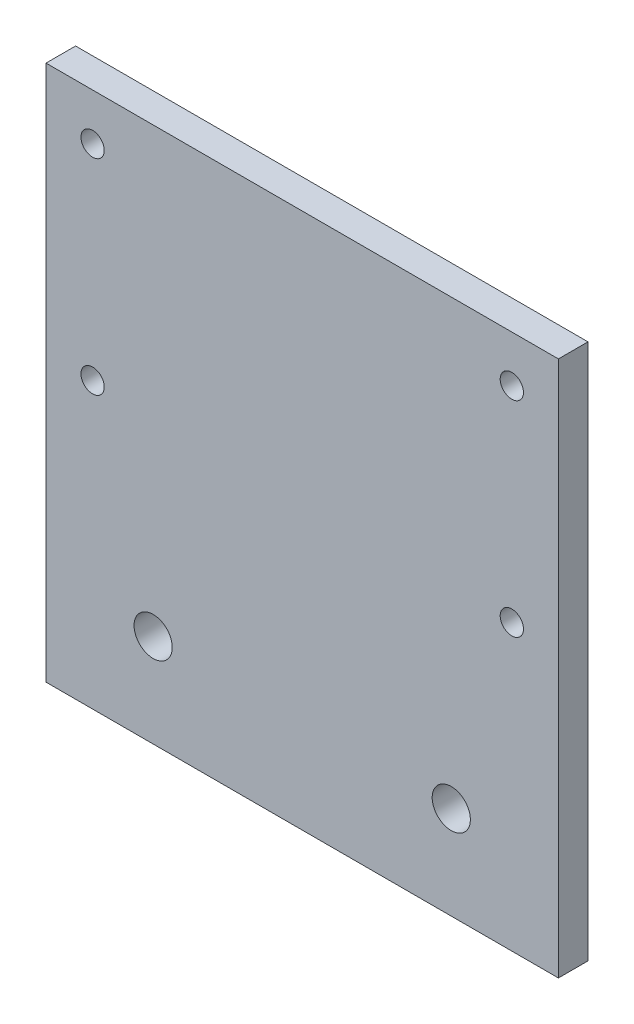
ISO-10303-21;
HEADER;
FILE_DESCRIPTION(('STEP AP214'),'2;1');
FILE_NAME('part.step','',(''),(''),'','','');
FILE_SCHEMA(('AUTOMOTIVE_DESIGN { 1 0 10303 214 1 1 1 1 }'));
ENDSEC;
DATA;
#1=APPLICATION_CONTEXT('core data for automotive mechanical design processes');
#2=APPLICATION_PROTOCOL_DEFINITION('international standard','automotive_design',2000,#1);
#3=PRODUCT_CONTEXT('',#1,'mechanical');
#4=PRODUCT('Part','Part','',(#3));
#5=PRODUCT_RELATED_PRODUCT_CATEGORY('part','',(#4));
#6=PRODUCT_DEFINITION_FORMATION('','',#4);
#7=PRODUCT_DEFINITION_CONTEXT('part definition',#1,'design');
#8=PRODUCT_DEFINITION('design','',#6,#7);
#9=PRODUCT_DEFINITION_SHAPE('','',#8);
#10=(LENGTH_UNIT() NAMED_UNIT(*) SI_UNIT(.MILLI.,.METRE.));
#11=(NAMED_UNIT(*) PLANE_ANGLE_UNIT() SI_UNIT($,.RADIAN.));
#12=(NAMED_UNIT(*) SI_UNIT($,.STERADIAN.) SOLID_ANGLE_UNIT());
#13=UNCERTAINTY_MEASURE_WITH_UNIT(LENGTH_MEASURE(1.E-05),#10,'distance_accuracy_value','');
#14=(GEOMETRIC_REPRESENTATION_CONTEXT(3) GLOBAL_UNCERTAINTY_ASSIGNED_CONTEXT((#13)) GLOBAL_UNIT_ASSIGNED_CONTEXT((#10,
#11,#12)) REPRESENTATION_CONTEXT('',''));
#15=CARTESIAN_POINT('',(0.,0.,0.));
#16=DIRECTION('',(0.,0.,1.));
#17=DIRECTION('',(1.,0.,0.));
#18=AXIS2_PLACEMENT_3D('',#15,#16,#17);
#19=CARTESIAN_POINT('',(0.,0.,3.175));
#20=DIRECTION('',(0.,0.,-1.));
#21=DIRECTION('',(-1.,0.,0.));
#22=AXIS2_PLACEMENT_3D('',#19,#20,#21);
#23=PLANE('',#22);
#24=DIRECTION('',(0.,-1.,0.));
#25=VECTOR('',#24,1.);
#26=CARTESIAN_POINT('',(0.,0.,3.175));
#27=LINE('',#26,#25);
#28=CARTESIAN_POINT('',(0.,57.55,3.175));
#29=VERTEX_POINT('',#28);
#30=CARTESIAN_POINT('',(0.,0.,3.175));
#31=VERTEX_POINT('',#30);
#32=EDGE_CURVE('E92',#29,#31,#27,.T.);
#33=ORIENTED_EDGE('',*,*,#32,.T.);
#34=DIRECTION('',(1.,0.,0.));
#35=VECTOR('',#34,1.);
#36=CARTESIAN_POINT('',(0.,0.,3.175));
#37=LINE('',#36,#35);
#38=CARTESIAN_POINT('',(55.,0.,3.175));
#39=VERTEX_POINT('',#38);
#40=EDGE_CURVE('E87',#31,#39,#37,.T.);
#41=ORIENTED_EDGE('',*,*,#40,.T.);
#42=DIRECTION('',(0.,1.,0.));
#43=VECTOR('',#42,1.);
#44=CARTESIAN_POINT('',(55.,0.,3.175));
#45=LINE('',#44,#43);
#46=CARTESIAN_POINT('',(55.,57.55,3.175));
#47=VERTEX_POINT('',#46);
#48=EDGE_CURVE('E90',#39,#47,#45,.T.);
#49=ORIENTED_EDGE('',*,*,#48,.T.);
#50=DIRECTION('',(-1.,0.,0.));
#51=VECTOR('',#50,1.);
#52=CARTESIAN_POINT('',(0.,57.55,3.175));
#53=LINE('',#52,#51);
#54=EDGE_CURVE('E57',#47,#29,#53,.T.);
#55=ORIENTED_EDGE('',*,*,#54,.T.);
#56=EDGE_LOOP('',(#33,#41,#49,#55));
#57=FACE_BOUND('',#56,.T.);
#58=CARTESIAN_POINT('',(4.99999999999999,52.55,3.175));
#59=DIRECTION('',(0.,0.,1.));
#60=DIRECTION('',(1.,0.,0.));
#61=AXIS2_PLACEMENT_3D('',#58,#59,#60);
#62=CIRCLE('',#61,1.25);
#63=CARTESIAN_POINT('',(6.24999999999999,52.55,3.175));
#64=VERTEX_POINT('',#63);
#65=EDGE_CURVE('E112',#64,#64,#62,.T.);
#66=ORIENTED_EDGE('',*,*,#65,.F.);
#67=EDGE_LOOP('',(#66));
#68=FACE_BOUND('',#67,.T.);
#69=CARTESIAN_POINT('',(11.5,9.99999999999999,3.175));
#70=DIRECTION('',(0.,0.,1.));
#71=DIRECTION('',(1.,0.,0.));
#72=AXIS2_PLACEMENT_3D('',#69,#70,#71);
#73=CIRCLE('',#72,2.05);
#74=CARTESIAN_POINT('',(13.55,9.99999999999999,3.175));
#75=VERTEX_POINT('',#74);
#76=EDGE_CURVE('E134',#75,#75,#73,.T.);
#77=ORIENTED_EDGE('',*,*,#76,.F.);
#78=EDGE_LOOP('',(#77));
#79=FACE_BOUND('',#78,.T.);
#80=CARTESIAN_POINT('',(50.,52.55,3.175));
#81=DIRECTION('',(0.,0.,1.));
#82=DIRECTION('',(1.,0.,0.));
#83=AXIS2_PLACEMENT_3D('',#80,#81,#82);
#84=CIRCLE('',#83,1.25);
#85=CARTESIAN_POINT('',(51.25,52.55,3.175));
#86=VERTEX_POINT('',#85);
#87=EDGE_CURVE('E142',#86,#86,#84,.T.);
#88=ORIENTED_EDGE('',*,*,#87,.F.);
#89=EDGE_LOOP('',(#88));
#90=FACE_BOUND('',#89,.T.);
#91=CARTESIAN_POINT('',(50.0000000000002,30.55,3.175));
#92=DIRECTION('',(0.,0.,1.));
#93=DIRECTION('',(1.,0.,0.));
#94=AXIS2_PLACEMENT_3D('',#91,#92,#93);
#95=CIRCLE('',#94,1.25);
#96=CARTESIAN_POINT('',(51.2500000000002,30.55,3.175));
#97=VERTEX_POINT('',#96);
#98=EDGE_CURVE('E150',#97,#97,#95,.T.);
#99=ORIENTED_EDGE('',*,*,#98,.F.);
#100=EDGE_LOOP('',(#99));
#101=FACE_BOUND('',#100,.T.);
#102=CARTESIAN_POINT('',(5.00000000000022,30.55,3.175));
#103=DIRECTION('',(0.,0.,1.));
#104=DIRECTION('',(1.,0.,0.));
#105=AXIS2_PLACEMENT_3D('',#102,#103,#104);
#106=CIRCLE('',#105,1.25);
#107=CARTESIAN_POINT('',(6.25000000000022,30.55,3.175));
#108=VERTEX_POINT('',#107);
#109=EDGE_CURVE('E158',#108,#108,#106,.T.);
#110=ORIENTED_EDGE('',*,*,#109,.F.);
#111=EDGE_LOOP('',(#110));
#112=FACE_BOUND('',#111,.T.);
#113=CARTESIAN_POINT('',(43.5,10.,3.175));
#114=DIRECTION('',(0.,0.,1.));
#115=DIRECTION('',(1.,0.,0.));
#116=AXIS2_PLACEMENT_3D('',#113,#114,#115);
#117=CIRCLE('',#116,2.05);
#118=CARTESIAN_POINT('',(45.55,10.,3.175));
#119=VERTEX_POINT('',#118);
#120=EDGE_CURVE('E166',#119,#119,#117,.T.);
#121=ORIENTED_EDGE('',*,*,#120,.F.);
#122=EDGE_LOOP('',(#121));
#123=FACE_BOUND('',#122,.T.);
#124=ADVANCED_FACE('F39',(#57,#68,#79,#90,#101,#112,#123),#23,.F.);
#125=CARTESIAN_POINT('',(0.,0.,0.));
#126=DIRECTION('',(0.,0.,-1.));
#127=DIRECTION('',(-1.,0.,0.));
#128=AXIS2_PLACEMENT_3D('',#125,#126,#127);
#129=PLANE('',#128);
#130=CARTESIAN_POINT('',(5.00000000000022,30.55,0.));
#131=DIRECTION('',(0.,0.,1.));
#132=DIRECTION('',(1.,0.,0.));
#133=AXIS2_PLACEMENT_3D('',#130,#131,#132);
#134=CIRCLE('',#133,1.25);
#135=CARTESIAN_POINT('',(6.25000000000022,30.55,0.));
#136=VERTEX_POINT('',#135);
#137=EDGE_CURVE('E162',#136,#136,#134,.T.);
#138=ORIENTED_EDGE('',*,*,#137,.T.);
#139=EDGE_LOOP('',(#138));
#140=FACE_BOUND('',#139,.T.);
#141=CARTESIAN_POINT('',(50.,52.55,0.));
#142=DIRECTION('',(0.,0.,1.));
#143=DIRECTION('',(1.,0.,0.));
#144=AXIS2_PLACEMENT_3D('',#141,#142,#143);
#145=CIRCLE('',#144,1.25);
#146=CARTESIAN_POINT('',(51.25,52.55,0.));
#147=VERTEX_POINT('',#146);
#148=EDGE_CURVE('E146',#147,#147,#145,.T.);
#149=ORIENTED_EDGE('',*,*,#148,.T.);
#150=EDGE_LOOP('',(#149));
#151=FACE_BOUND('',#150,.T.);
#152=CARTESIAN_POINT('',(4.99999999999999,52.55,0.));
#153=DIRECTION('',(0.,0.,1.));
#154=DIRECTION('',(1.,0.,0.));
#155=AXIS2_PLACEMENT_3D('',#152,#153,#154);
#156=CIRCLE('',#155,1.25);
#157=CARTESIAN_POINT('',(6.24999999999999,52.55,0.));
#158=VERTEX_POINT('',#157);
#159=EDGE_CURVE('E130',#158,#158,#156,.T.);
#160=ORIENTED_EDGE('',*,*,#159,.T.);
#161=EDGE_LOOP('',(#160));
#162=FACE_BOUND('',#161,.T.);
#163=DIRECTION('',(0.,-1.,0.));
#164=VECTOR('',#163,1.);
#165=CARTESIAN_POINT('',(0.,0.,0.));
#166=LINE('',#165,#164);
#167=CARTESIAN_POINT('',(0.,57.55,0.));
#168=VERTEX_POINT('',#167);
#169=CARTESIAN_POINT('',(0.,0.,0.));
#170=VERTEX_POINT('',#169);
#171=EDGE_CURVE('E108',#168,#170,#166,.T.);
#172=ORIENTED_EDGE('',*,*,#171,.F.);
#173=DIRECTION('',(-1.,0.,0.));
#174=VECTOR('',#173,1.);
#175=CARTESIAN_POINT('',(0.,57.55,0.));
#176=LINE('',#175,#174);
#177=CARTESIAN_POINT('',(55.,57.55,0.));
#178=VERTEX_POINT('',#177);
#179=EDGE_CURVE('E80',#178,#168,#176,.T.);
#180=ORIENTED_EDGE('',*,*,#179,.F.);
#181=DIRECTION('',(0.,1.,0.));
#182=VECTOR('',#181,1.);
#183=CARTESIAN_POINT('',(55.,0.,0.));
#184=LINE('',#183,#182);
#185=CARTESIAN_POINT('',(55.,0.,0.));
#186=VERTEX_POINT('',#185);
#187=EDGE_CURVE('E74',#186,#178,#184,.T.);
#188=ORIENTED_EDGE('',*,*,#187,.F.);
#189=DIRECTION('',(1.,0.,0.));
#190=VECTOR('',#189,1.);
#191=CARTESIAN_POINT('',(0.,0.,0.));
#192=LINE('',#191,#190);
#193=EDGE_CURVE('E97',#170,#186,#192,.T.);
#194=ORIENTED_EDGE('',*,*,#193,.F.);
#195=EDGE_LOOP('',(#172,#180,#188,#194));
#196=FACE_BOUND('',#195,.T.);
#197=CARTESIAN_POINT('',(11.5,9.99999999999999,0.));
#198=DIRECTION('',(0.,0.,1.));
#199=DIRECTION('',(1.,0.,0.));
#200=AXIS2_PLACEMENT_3D('',#197,#198,#199);
#201=CIRCLE('',#200,2.05);
#202=CARTESIAN_POINT('',(13.55,9.99999999999999,0.));
#203=VERTEX_POINT('',#202);
#204=EDGE_CURVE('E138',#203,#203,#201,.T.);
#205=ORIENTED_EDGE('',*,*,#204,.T.);
#206=EDGE_LOOP('',(#205));
#207=FACE_BOUND('',#206,.T.);
#208=CARTESIAN_POINT('',(50.0000000000002,30.55,0.));
#209=DIRECTION('',(0.,0.,1.));
#210=DIRECTION('',(1.,0.,0.));
#211=AXIS2_PLACEMENT_3D('',#208,#209,#210);
#212=CIRCLE('',#211,1.25);
#213=CARTESIAN_POINT('',(51.2500000000002,30.55,0.));
#214=VERTEX_POINT('',#213);
#215=EDGE_CURVE('E154',#214,#214,#212,.T.);
#216=ORIENTED_EDGE('',*,*,#215,.T.);
#217=EDGE_LOOP('',(#216));
#218=FACE_BOUND('',#217,.T.);
#219=CARTESIAN_POINT('',(43.5,10.,0.));
#220=DIRECTION('',(0.,0.,1.));
#221=DIRECTION('',(1.,0.,0.));
#222=AXIS2_PLACEMENT_3D('',#219,#220,#221);
#223=CIRCLE('',#222,2.05);
#224=CARTESIAN_POINT('',(45.55,10.,0.));
#225=VERTEX_POINT('',#224);
#226=EDGE_CURVE('E170',#225,#225,#223,.T.);
#227=ORIENTED_EDGE('',*,*,#226,.T.);
#228=EDGE_LOOP('',(#227));
#229=FACE_BOUND('',#228,.T.);
#230=ADVANCED_FACE('F125',(#140,#151,#162,#196,#207,#218,#229),#129,.T.);
#231=CARTESIAN_POINT('',(0.,0.,3.175));
#232=DIRECTION('',(1.,0.,0.));
#233=DIRECTION('',(0.,0.,-1.));
#234=AXIS2_PLACEMENT_3D('',#231,#232,#233);
#235=PLANE('',#234);
#236=ORIENTED_EDGE('',*,*,#171,.T.);
#237=DIRECTION('',(0.,0.,-1.));
#238=VECTOR('',#237,1.);
#239=CARTESIAN_POINT('',(0.,0.,3.175));
#240=LINE('',#239,#238);
#241=EDGE_CURVE('E11',#31,#170,#240,.T.);
#242=ORIENTED_EDGE('',*,*,#241,.F.);
#243=ORIENTED_EDGE('',*,*,#32,.F.);
#244=DIRECTION('',(0.,0.,-1.));
#245=VECTOR('',#244,1.);
#246=CARTESIAN_POINT('',(0.,57.55,3.175));
#247=LINE('',#246,#245);
#248=EDGE_CURVE('E104',#29,#168,#247,.T.);
#249=ORIENTED_EDGE('',*,*,#248,.T.);
#250=EDGE_LOOP('',(#236,#242,#243,#249));
#251=FACE_BOUND('',#250,.T.);
#252=ADVANCED_FACE('F41',(#251),#235,.F.);
#253=CARTESIAN_POINT('',(0.,0.,3.175));
#254=DIRECTION('',(0.,1.,0.));
#255=DIRECTION('',(-1.,0.,0.));
#256=AXIS2_PLACEMENT_3D('',#253,#254,#255);
#257=PLANE('',#256);
#258=ORIENTED_EDGE('',*,*,#193,.T.);
#259=DIRECTION('',(0.,0.,-1.));
#260=VECTOR('',#259,1.);
#261=CARTESIAN_POINT('',(55.,0.,3.175));
#262=LINE('',#261,#260);
#263=EDGE_CURVE('E49',#39,#186,#262,.T.);
#264=ORIENTED_EDGE('',*,*,#263,.F.);
#265=ORIENTED_EDGE('',*,*,#40,.F.);
#266=ORIENTED_EDGE('',*,*,#241,.T.);
#267=EDGE_LOOP('',(#258,#264,#265,#266));
#268=FACE_BOUND('',#267,.T.);
#269=ADVANCED_FACE('F96',(#268),#257,.F.);
#270=CARTESIAN_POINT('',(55.,0.,3.175));
#271=DIRECTION('',(-1.,0.,0.));
#272=DIRECTION('',(0.,-1.,0.));
#273=AXIS2_PLACEMENT_3D('',#270,#271,#272);
#274=PLANE('',#273);
#275=ORIENTED_EDGE('',*,*,#187,.T.);
#276=DIRECTION('',(0.,0.,-1.));
#277=VECTOR('',#276,1.);
#278=CARTESIAN_POINT('',(55.,57.55,3.175));
#279=LINE('',#278,#277);
#280=EDGE_CURVE('E99',#47,#178,#279,.T.);
#281=ORIENTED_EDGE('',*,*,#280,.F.);
#282=ORIENTED_EDGE('',*,*,#48,.F.);
#283=ORIENTED_EDGE('',*,*,#263,.T.);
#284=EDGE_LOOP('',(#275,#281,#282,#283));
#285=FACE_BOUND('',#284,.T.);
#286=ADVANCED_FACE('F100',(#285),#274,.F.);
#287=CARTESIAN_POINT('',(0.,57.55,3.175));
#288=DIRECTION('',(0.,-1.,0.));
#289=DIRECTION('',(1.,0.,0.));
#290=AXIS2_PLACEMENT_3D('',#287,#288,#289);
#291=PLANE('',#290);
#292=ORIENTED_EDGE('',*,*,#179,.T.);
#293=ORIENTED_EDGE('',*,*,#248,.F.);
#294=ORIENTED_EDGE('',*,*,#54,.F.);
#295=ORIENTED_EDGE('',*,*,#280,.T.);
#296=EDGE_LOOP('',(#292,#293,#294,#295));
#297=FACE_BOUND('',#296,.T.);
#298=ADVANCED_FACE('F122',(#297),#291,.F.);
#299=CARTESIAN_POINT('',(4.99999999999999,52.55,3.175));
#300=DIRECTION('',(0.,0.,-1.));
#301=DIRECTION('',(-1.,0.,0.));
#302=AXIS2_PLACEMENT_3D('',#299,#300,#301);
#303=CYLINDRICAL_SURFACE('',#302,1.25);
#304=ORIENTED_EDGE('',*,*,#65,.T.);
#305=EDGE_LOOP('',(#304));
#306=FACE_BOUND('',#305,.T.);
#307=ORIENTED_EDGE('',*,*,#159,.F.);
#308=EDGE_LOOP('',(#307));
#309=FACE_BOUND('',#308,.T.);
#310=ADVANCED_FACE('F189',(#306,#309),#303,.F.);
#311=CARTESIAN_POINT('',(11.5,9.99999999999999,3.175));
#312=DIRECTION('',(0.,0.,-1.));
#313=DIRECTION('',(-1.,0.,0.));
#314=AXIS2_PLACEMENT_3D('',#311,#312,#313);
#315=CYLINDRICAL_SURFACE('',#314,2.05);
#316=ORIENTED_EDGE('',*,*,#76,.T.);
#317=EDGE_LOOP('',(#316));
#318=FACE_BOUND('',#317,.T.);
#319=ORIENTED_EDGE('',*,*,#204,.F.);
#320=EDGE_LOOP('',(#319));
#321=FACE_BOUND('',#320,.T.);
#322=ADVANCED_FACE('F235',(#318,#321),#315,.F.);
#323=CARTESIAN_POINT('',(50.,52.55,3.175));
#324=DIRECTION('',(0.,0.,-1.));
#325=DIRECTION('',(-1.,0.,0.));
#326=AXIS2_PLACEMENT_3D('',#323,#324,#325);
#327=CYLINDRICAL_SURFACE('',#326,1.25);
#328=ORIENTED_EDGE('',*,*,#87,.T.);
#329=EDGE_LOOP('',(#328));
#330=FACE_BOUND('',#329,.T.);
#331=ORIENTED_EDGE('',*,*,#148,.F.);
#332=EDGE_LOOP('',(#331));
#333=FACE_BOUND('',#332,.T.);
#334=ADVANCED_FACE('F243',(#330,#333),#327,.F.);
#335=CARTESIAN_POINT('',(50.0000000000002,30.55,3.175));
#336=DIRECTION('',(0.,0.,-1.));
#337=DIRECTION('',(-1.,0.,0.));
#338=AXIS2_PLACEMENT_3D('',#335,#336,#337);
#339=CYLINDRICAL_SURFACE('',#338,1.25);
#340=ORIENTED_EDGE('',*,*,#98,.T.);
#341=EDGE_LOOP('',(#340));
#342=FACE_BOUND('',#341,.T.);
#343=ORIENTED_EDGE('',*,*,#215,.F.);
#344=EDGE_LOOP('',(#343));
#345=FACE_BOUND('',#344,.T.);
#346=ADVANCED_FACE('F251',(#342,#345),#339,.F.);
#347=CARTESIAN_POINT('',(5.00000000000022,30.55,3.175));
#348=DIRECTION('',(0.,0.,-1.));
#349=DIRECTION('',(-1.,0.,0.));
#350=AXIS2_PLACEMENT_3D('',#347,#348,#349);
#351=CYLINDRICAL_SURFACE('',#350,1.25);
#352=ORIENTED_EDGE('',*,*,#109,.T.);
#353=EDGE_LOOP('',(#352));
#354=FACE_BOUND('',#353,.T.);
#355=ORIENTED_EDGE('',*,*,#137,.F.);
#356=EDGE_LOOP('',(#355));
#357=FACE_BOUND('',#356,.T.);
#358=ADVANCED_FACE('F260',(#354,#357),#351,.F.);
#359=CARTESIAN_POINT('',(43.5,10.,3.175));
#360=DIRECTION('',(0.,0.,-1.));
#361=DIRECTION('',(-1.,0.,0.));
#362=AXIS2_PLACEMENT_3D('',#359,#360,#361);
#363=CYLINDRICAL_SURFACE('',#362,2.05);
#364=ORIENTED_EDGE('',*,*,#120,.T.);
#365=EDGE_LOOP('',(#364));
#366=FACE_BOUND('',#365,.T.);
#367=ORIENTED_EDGE('',*,*,#226,.F.);
#368=EDGE_LOOP('',(#367));
#369=FACE_BOUND('',#368,.T.);
#370=ADVANCED_FACE('F178',(#366,#369),#363,.F.);
#371=CLOSED_SHELL('',(#124,#230,#252,#269,#286,#298,#310,#322,#334,#346,#358,#370));
#372=MANIFOLD_SOLID_BREP('B2',#371);
#373=ADVANCED_BREP_SHAPE_REPRESENTATION('',(#18,#372),#14);
#374=SHAPE_DEFINITION_REPRESENTATION(#9,#373);
ENDSEC;
END-ISO-10303-21;
